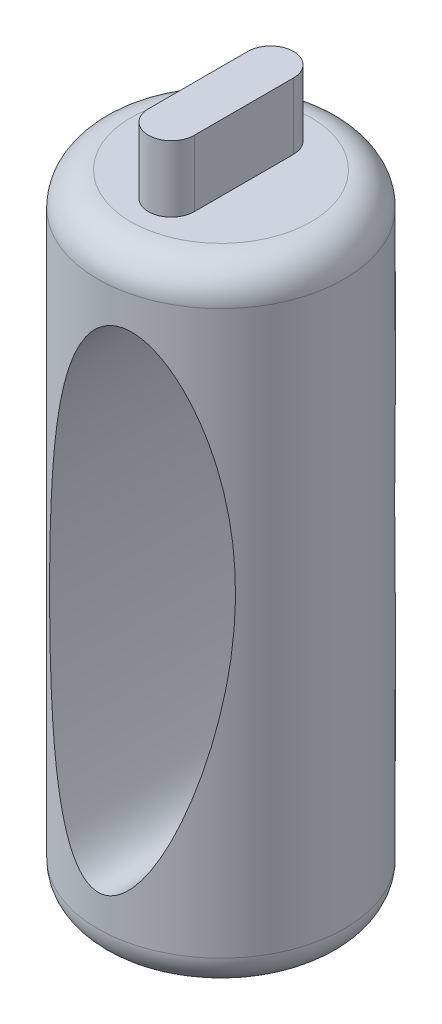
ISO-10303-21;
HEADER;
FILE_DESCRIPTION(('STEP AP214'),'2;1');
FILE_NAME('part.step','',(''),(''),'','','');
FILE_SCHEMA(('AUTOMOTIVE_DESIGN { 1 0 10303 214 1 1 1 1 }'));
ENDSEC;
DATA;
#1=APPLICATION_CONTEXT('core data for automotive mechanical design processes');
#2=APPLICATION_PROTOCOL_DEFINITION('international standard','automotive_design',2000,#1);
#3=PRODUCT_CONTEXT('',#1,'mechanical');
#4=PRODUCT('Part','Part','',(#3));
#5=PRODUCT_RELATED_PRODUCT_CATEGORY('part','',(#4));
#6=PRODUCT_DEFINITION_FORMATION('','',#4);
#7=PRODUCT_DEFINITION_CONTEXT('part definition',#1,'design');
#8=PRODUCT_DEFINITION('design','',#6,#7);
#9=PRODUCT_DEFINITION_SHAPE('','',#8);
#10=(LENGTH_UNIT() NAMED_UNIT(*) SI_UNIT(.MILLI.,.METRE.));
#11=(NAMED_UNIT(*) PLANE_ANGLE_UNIT() SI_UNIT($,.RADIAN.));
#12=(NAMED_UNIT(*) SI_UNIT($,.STERADIAN.) SOLID_ANGLE_UNIT());
#13=UNCERTAINTY_MEASURE_WITH_UNIT(LENGTH_MEASURE(1.E-05),#10,'distance_accuracy_value','');
#14=(GEOMETRIC_REPRESENTATION_CONTEXT(3) GLOBAL_UNCERTAINTY_ASSIGNED_CONTEXT((#13)) GLOBAL_UNIT_ASSIGNED_CONTEXT((#10,
#11,#12)) REPRESENTATION_CONTEXT('',''));
#15=CARTESIAN_POINT('',(0.,0.,0.));
#16=DIRECTION('',(0.,0.,1.));
#17=DIRECTION('',(1.,0.,0.));
#18=AXIS2_PLACEMENT_3D('',#15,#16,#17);
#19=CARTESIAN_POINT('',(0.,42.,-3.));
#20=DIRECTION('',(0.,-1.,0.));
#21=DIRECTION('',(0.,0.,-1.));
#22=AXIS2_PLACEMENT_3D('',#19,#20,#21);
#23=CYLINDRICAL_SURFACE('',#22,1.38570218312154);
#24=CARTESIAN_POINT('',(0.,38.,-3.));
#25=DIRECTION('',(0.,1.,0.));
#26=DIRECTION('',(0.,0.,1.));
#27=AXIS2_PLACEMENT_3D('',#24,#25,#26);
#28=CIRCLE('',#27,1.38570218312154);
#29=CARTESIAN_POINT('',(1.38570218312154,38.,-3.));
#30=VERTEX_POINT('',#29);
#31=CARTESIAN_POINT('',(-1.38570218312154,38.,-3.));
#32=VERTEX_POINT('',#31);
#33=EDGE_CURVE('E104',#30,#32,#28,.T.);
#34=ORIENTED_EDGE('',*,*,#33,.T.);
#35=DIRECTION('',(0.,-1.,0.));
#36=VECTOR('',#35,1.);
#37=CARTESIAN_POINT('',(-1.38570218312154,42.,-3.));
#38=LINE('',#37,#36);
#39=CARTESIAN_POINT('',(-1.38570218312154,42.,-3.));
#40=VERTEX_POINT('',#39);
#41=EDGE_CURVE('E12',#40,#32,#38,.T.);
#42=ORIENTED_EDGE('',*,*,#41,.F.);
#43=CARTESIAN_POINT('',(0.,42.,-3.));
#44=DIRECTION('',(0.,1.,0.));
#45=DIRECTION('',(0.,0.,1.));
#46=AXIS2_PLACEMENT_3D('',#43,#44,#45);
#47=CIRCLE('',#46,1.38570218312154);
#48=CARTESIAN_POINT('',(1.38570218312154,42.,-3.));
#49=VERTEX_POINT('',#48);
#50=EDGE_CURVE('E92',#49,#40,#47,.T.);
#51=ORIENTED_EDGE('',*,*,#50,.F.);
#52=DIRECTION('',(0.,-1.,0.));
#53=VECTOR('',#52,1.);
#54=CARTESIAN_POINT('',(1.38570218312154,42.,-3.));
#55=LINE('',#54,#53);
#56=EDGE_CURVE('E100',#49,#30,#55,.T.);
#57=ORIENTED_EDGE('',*,*,#56,.T.);
#58=EDGE_LOOP('',(#34,#42,#51,#57));
#59=FACE_BOUND('',#58,.T.);
#60=ADVANCED_FACE('F41',(#59),#23,.T.);
#61=CARTESIAN_POINT('',(-1.38570218312154,42.,-3.));
#62=DIRECTION('',(1.,0.,0.));
#63=DIRECTION('',(0.,0.,-1.));
#64=AXIS2_PLACEMENT_3D('',#61,#62,#63);
#65=PLANE('',#64);
#66=DIRECTION('',(0.,0.,1.));
#67=VECTOR('',#66,1.);
#68=CARTESIAN_POINT('',(-1.38570218312154,38.,-3.));
#69=LINE('',#68,#67);
#70=CARTESIAN_POINT('',(-1.38570218312154,38.,3.));
#71=VERTEX_POINT('',#70);
#72=EDGE_CURVE('E96',#32,#71,#69,.T.);
#73=ORIENTED_EDGE('',*,*,#72,.T.);
#74=DIRECTION('',(0.,-1.,0.));
#75=VECTOR('',#74,1.);
#76=CARTESIAN_POINT('',(-1.38570218312154,42.,3.));
#77=LINE('',#76,#75);
#78=CARTESIAN_POINT('',(-1.38570218312154,42.,3.));
#79=VERTEX_POINT('',#78);
#80=EDGE_CURVE('E49',#79,#71,#77,.T.);
#81=ORIENTED_EDGE('',*,*,#80,.F.);
#82=DIRECTION('',(0.,0.,1.));
#83=VECTOR('',#82,1.);
#84=CARTESIAN_POINT('',(-1.38570218312154,42.,-3.));
#85=LINE('',#84,#83);
#86=EDGE_CURVE('E87',#40,#79,#85,.T.);
#87=ORIENTED_EDGE('',*,*,#86,.F.);
#88=ORIENTED_EDGE('',*,*,#41,.T.);
#89=EDGE_LOOP('',(#73,#81,#87,#88));
#90=FACE_BOUND('',#89,.T.);
#91=ADVANCED_FACE('F95',(#90),#65,.F.);
#92=CARTESIAN_POINT('',(0.,42.,3.));
#93=DIRECTION('',(0.,-1.,0.));
#94=DIRECTION('',(0.,0.,-1.));
#95=AXIS2_PLACEMENT_3D('',#92,#93,#94);
#96=CYLINDRICAL_SURFACE('',#95,1.38570218312154);
#97=CARTESIAN_POINT('',(0.,38.,3.));
#98=DIRECTION('',(0.,1.,0.));
#99=DIRECTION('',(0.,0.,1.));
#100=AXIS2_PLACEMENT_3D('',#97,#98,#99);
#101=CIRCLE('',#100,1.38570218312154);
#102=CARTESIAN_POINT('',(1.38570218312154,38.,3.));
#103=VERTEX_POINT('',#102);
#104=EDGE_CURVE('E74',#71,#103,#101,.T.);
#105=ORIENTED_EDGE('',*,*,#104,.T.);
#106=DIRECTION('',(0.,-1.,0.));
#107=VECTOR('',#106,1.);
#108=CARTESIAN_POINT('',(1.38570218312154,42.,3.));
#109=LINE('',#108,#107);
#110=CARTESIAN_POINT('',(1.38570218312154,42.,3.));
#111=VERTEX_POINT('',#110);
#112=EDGE_CURVE('E97',#111,#103,#109,.T.);
#113=ORIENTED_EDGE('',*,*,#112,.F.);
#114=CARTESIAN_POINT('',(0.,42.,3.));
#115=DIRECTION('',(0.,1.,0.));
#116=DIRECTION('',(0.,0.,1.));
#117=AXIS2_PLACEMENT_3D('',#114,#115,#116);
#118=CIRCLE('',#117,1.38570218312154);
#119=EDGE_CURVE('E90',#79,#111,#118,.T.);
#120=ORIENTED_EDGE('',*,*,#119,.F.);
#121=ORIENTED_EDGE('',*,*,#80,.T.);
#122=EDGE_LOOP('',(#105,#113,#120,#121));
#123=FACE_BOUND('',#122,.T.);
#124=ADVANCED_FACE('F98',(#123),#96,.T.);
#125=CARTESIAN_POINT('',(1.38570218312154,42.,-3.));
#126=DIRECTION('',(-1.,0.,0.));
#127=DIRECTION('',(0.,0.,1.));
#128=AXIS2_PLACEMENT_3D('',#125,#126,#127);
#129=PLANE('',#128);
#130=DIRECTION('',(0.,0.,-1.));
#131=VECTOR('',#130,1.);
#132=CARTESIAN_POINT('',(1.38570218312154,38.,-3.));
#133=LINE('',#132,#131);
#134=EDGE_CURVE('E80',#103,#30,#133,.T.);
#135=ORIENTED_EDGE('',*,*,#134,.T.);
#136=ORIENTED_EDGE('',*,*,#56,.F.);
#137=DIRECTION('',(0.,0.,-1.));
#138=VECTOR('',#137,1.);
#139=CARTESIAN_POINT('',(1.38570218312154,42.,-3.));
#140=LINE('',#139,#138);
#141=EDGE_CURVE('E57',#111,#49,#140,.T.);
#142=ORIENTED_EDGE('',*,*,#141,.F.);
#143=ORIENTED_EDGE('',*,*,#112,.T.);
#144=EDGE_LOOP('',(#135,#136,#142,#143));
#145=FACE_BOUND('',#144,.T.);
#146=ADVANCED_FACE('F111',(#145),#129,.F.);
#147=CARTESIAN_POINT('',(0.,42.,-3.));
#148=DIRECTION('',(0.,1.,0.));
#149=DIRECTION('',(0.,0.,1.));
#150=AXIS2_PLACEMENT_3D('',#147,#148,#149);
#151=PLANE('',#150);
#152=ORIENTED_EDGE('',*,*,#50,.T.);
#153=ORIENTED_EDGE('',*,*,#86,.T.);
#154=ORIENTED_EDGE('',*,*,#119,.T.);
#155=ORIENTED_EDGE('',*,*,#141,.T.);
#156=EDGE_LOOP('',(#152,#153,#154,#155));
#157=FACE_BOUND('',#156,.T.);
#158=ADVANCED_FACE('F88',(#157),#151,.T.);
#159=CARTESIAN_POINT('',(0.,38.,-3.));
#160=DIRECTION('',(0.,1.,0.));
#161=DIRECTION('',(0.,0.,1.));
#162=AXIS2_PLACEMENT_3D('',#159,#160,#161);
#163=PLANE('',#162);
#164=ORIENTED_EDGE('',*,*,#33,.F.);
#165=ORIENTED_EDGE('',*,*,#134,.F.);
#166=ORIENTED_EDGE('',*,*,#104,.F.);
#167=ORIENTED_EDGE('',*,*,#72,.F.);
#168=EDGE_LOOP('',(#164,#165,#166,#167));
#169=FACE_BOUND('',#168,.T.);
#170=ADVANCED_FACE('F114',(#169),#163,.F.);
#171=CLOSED_SHELL('',(#60,#91,#124,#146,#158,#170));
#172=MANIFOLD_SOLID_BREP('B2',#171);
#173=CARTESIAN_POINT('',(0.,38.,0.));
#174=DIRECTION('',(0.,-1.,0.));
#175=DIRECTION('',(0.,0.,-1.));
#176=AXIS2_PLACEMENT_3D('',#173,#174,#175);
#177=CYLINDRICAL_SURFACE('',#176,7.45);
#178=CARTESIAN_POINT('',(0.,33.445763635603,-7.45));
#179=CARTESIAN_POINT('',(-0.095559366362131,33.3616353146619,-7.45000133325339));
#180=CARTESIAN_POINT('',(-0.18685954519611,33.2726639794885,-7.44817186689996));
#181=CARTESIAN_POINT('',(-0.362034543329289,33.0877225588869,-7.44171447493551));
#182=CARTESIAN_POINT('',(-0.445900833662442,32.9917446591259,-7.43708338144601));
#183=CARTESIAN_POINT('',(-0.607531411127159,32.7941749896589,-7.42563106159477));
#184=CARTESIAN_POINT('',(-0.685264655916412,32.6925586067938,-7.41879948509376));
#185=CARTESIAN_POINT('',(-0.835030740059926,32.4854241257201,-7.40343725277449));
#186=CARTESIAN_POINT('',(-0.907065706480859,32.3799075051884,-7.39490723517613));
#187=CARTESIAN_POINT('',(-1.05844211720148,32.1469684208612,-7.37489075051447));
#188=CARTESIAN_POINT('',(-1.13684021875951,32.0189572628576,-7.36314816898597));
#189=CARTESIAN_POINT('',(-1.28777916363685,31.7596581308598,-7.3382538338295));
#190=CARTESIAN_POINT('',(-1.36031905535099,31.6283696290116,-7.3251018520633));
#191=CARTESIAN_POINT('',(-1.50012336615484,31.3635179698189,-7.29775249243825));
#192=CARTESIAN_POINT('',(-1.56739947607325,31.2299607043427,-7.28355757536031));
#193=CARTESIAN_POINT('',(-1.69745770886317,30.9607574778237,-7.25434831105244));
#194=CARTESIAN_POINT('',(-1.76023933785904,30.8251112892236,-7.23933387408815));
#195=CARTESIAN_POINT('',(-1.94228538612534,30.416282781792,-7.19345047834024));
#196=CARTESIAN_POINT('',(-2.05559554600674,30.1405436873183,-7.16167078535632));
#197=CARTESIAN_POINT('',(-2.26919928592416,29.5841349338461,-7.09687576104809));
#198=CARTESIAN_POINT('',(-2.36948666688798,29.3034629983759,-7.06385985082641));
#199=CARTESIAN_POINT('',(-2.55902775265801,28.7382451477841,-6.99742549629972));
#200=CARTESIAN_POINT('',(-2.64827310382258,28.453696478273,-6.9640067679722));
#201=CARTESIAN_POINT('',(-2.81707891731236,27.8816910740069,-6.89744796386881));
#202=CARTESIAN_POINT('',(-2.8966382909451,27.5942340162782,-6.86430791980572));
#203=CARTESIAN_POINT('',(-3.04712984956476,27.0169281080915,-6.79884033710758));
#204=CARTESIAN_POINT('',(-3.11806037668168,26.7270788093969,-6.76651295555389));
#205=CARTESIAN_POINT('',(-3.25207453888987,26.1454217457018,-6.70313370502013));
#206=CARTESIAN_POINT('',(-3.31515770614574,25.8536138650287,-6.67208191216055));
#207=CARTESIAN_POINT('',(-3.43399641823802,25.2687570993174,-6.61170213502369));
#208=CARTESIAN_POINT('',(-3.48976192199809,24.9757104731335,-6.58237183859638));
#209=CARTESIAN_POINT('',(-3.59452341543175,24.3882097999038,-6.52575164487648));
#210=CARTESIAN_POINT('',(-3.64351913742548,24.0937556976819,-6.49846182828485));
#211=CARTESIAN_POINT('',(-3.78087850324158,23.2087087547653,-6.42017494573415));
#212=CARTESIAN_POINT('',(-3.85964442724857,22.6162810678218,-6.37274460644442));
#213=CARTESIAN_POINT('',(-3.99336064127281,21.4279873858046,-6.28981087810162));
#214=CARTESIAN_POINT('',(-4.0483125800306,20.8321216316578,-6.25430666339197));
#215=CARTESIAN_POINT('',(-4.13515321713304,19.6380143258245,-6.19723490973267));
#216=CARTESIAN_POINT('',(-4.16704138456758,19.0397727197663,-6.17566769160307));
#217=CARTESIAN_POINT('',(-4.20767177152846,17.842049320868,-6.14805656498741));
#218=CARTESIAN_POINT('',(-4.21641046160843,17.2425673528603,-6.14201502360193));
#219=CARTESIAN_POINT('',(-4.20984384846647,16.0437156036525,-6.14652591117268));
#220=CARTESIAN_POINT('',(-4.19453766114917,15.444345827388,-6.15707895028766));
#221=CARTESIAN_POINT('',(-4.15212357351087,14.5465013335333,-6.185677681845));
#222=CARTESIAN_POINT('',(-4.13473479889267,14.2473304290603,-6.19734429821697));
#223=CARTESIAN_POINT('',(-4.09310035968074,13.649666680584,-6.22492315190925));
#224=CARTESIAN_POINT('',(-4.06885502218835,13.351173804919,-6.24083518669426));
#225=CARTESIAN_POINT('',(-4.01305658764928,12.7551283745065,-6.27686047707864));
#226=CARTESIAN_POINT('',(-3.98150360271659,12.4575758054039,-6.29697366822337));
#227=CARTESIAN_POINT('',(-3.91050210369227,11.8637351625092,-6.34131126010247));
#228=CARTESIAN_POINT('',(-3.87105411105152,11.5674470065243,-6.36553538930081));
#229=CARTESIAN_POINT('',(-3.78353462709423,10.9767671250676,-6.41794110366845));
#230=CARTESIAN_POINT('',(-3.73547098351341,10.6823739242483,-6.44611908236396));
#231=CARTESIAN_POINT('',(-3.62971941896753,10.0958791881158,-6.50625407191333));
#232=CARTESIAN_POINT('',(-3.57203727378245,9.80377638700682,-6.53820881153994));
#233=CARTESIAN_POINT('',(-3.44568034079578,9.22239277587441,-6.60567339581533));
#234=CARTESIAN_POINT('',(-3.37700689498523,8.9331116259082,-6.64118280625595));
#235=CARTESIAN_POINT('',(-3.2266583648655,8.35775007371591,-6.71552357254923));
#236=CARTESIAN_POINT('',(-3.14495953801209,8.07167655766847,-6.75436093358453));
#237=CARTESIAN_POINT('',(-2.99072969182996,7.58333122681723,-6.82371231491368));
#238=CARTESIAN_POINT('',(-2.9219251353869,7.37979084043545,-6.85355294421821));
#239=CARTESIAN_POINT('',(-2.77465944469615,6.97630215876276,-6.91448700828101));
#240=CARTESIAN_POINT('',(-2.69619438266188,6.7763553626752,-6.94558094913413));
#241=CARTESIAN_POINT('',(-2.52791882591415,6.38209763931932,-7.00858119061557));
#242=CARTESIAN_POINT('',(-2.43814519809346,6.1877708137921,-7.04048459393636));
#243=CARTESIAN_POINT('',(-2.29278793589763,5.90186019652106,-7.08859649953564));
#244=CARTESIAN_POINT('',(-2.24257144063859,5.80751745865319,-7.10467113940736));
#245=CARTESIAN_POINT('',(-2.13809492362413,5.6211049153731,-7.13680919809026));
#246=CARTESIAN_POINT('',(-2.08383575459147,5.52903463605414,-7.15287261855048));
#247=CARTESIAN_POINT('',(-1.98850640942773,5.37623803660738,-7.17983030835023));
#248=CARTESIAN_POINT('',(-1.94865417184928,5.31475957965109,-7.19076165350053));
#249=CARTESIAN_POINT('',(-1.86658203985435,5.19339213906903,-7.21250091610555));
#250=CARTESIAN_POINT('',(-1.82436217714045,5.13350313417626,-7.22330883521064));
#251=CARTESIAN_POINT('',(-1.69366645931783,4.95645195377749,-7.25548730948471));
#252=CARTESIAN_POINT('',(-1.60124341946877,4.84205116113146,-7.27658684198625));
#253=CARTESIAN_POINT('',(-1.45269862425409,4.67822811037508,-7.30717013286391));
#254=CARTESIAN_POINT('',(-1.40124987866035,4.62466919986994,-7.31723442646294));
#255=CARTESIAN_POINT('',(-1.29484484425385,4.52105603009372,-7.3368118832402));
#256=CARTESIAN_POINT('',(-1.23988793222888,4.47100239685208,-7.34632494791891));
#257=CARTESIAN_POINT('',(-1.06953666900331,4.32752116061669,-7.37372453395438));
#258=CARTESIAN_POINT('',(-0.948323565801315,4.24038477216817,-7.3905443799816));
#259=CARTESIAN_POINT('',(-0.73627108464257,4.11911366796558,-7.41399422363826));
#260=CARTESIAN_POINT('',(-0.650110657183516,4.07717503478659,-7.42211590925749));
#261=CARTESIAN_POINT('',(-0.516653245065489,4.02471912754626,-7.43219792840492));
#262=CARTESIAN_POINT('',(-0.471470026525689,4.00897702899386,-7.43520829350123));
#263=CARTESIAN_POINT('',(-0.379914581264785,3.98130796571057,-7.44044780136253));
#264=CARTESIAN_POINT('',(-0.333542856939019,3.96937941676725,-7.4426772685625));
#265=CARTESIAN_POINT('',(-0.23953479315141,3.9495422213257,-7.4462979190202));
#266=CARTESIAN_POINT('',(-0.191891438791491,3.9416654403883,-7.4476824727373));
#267=CARTESIAN_POINT('',(-0.09606789405951,3.93025960920155,-7.44953469768171));
#268=CARTESIAN_POINT('',(-0.0478877100069661,3.9267305078261,-7.45000237969092));
#269=CARTESIAN_POINT('',(0.0486048916722725,3.92407838136806,-7.44999760303277));
#270=CARTESIAN_POINT('',(0.0969173337297471,3.92495623418111,-7.44952495705692));
#271=CARTESIAN_POINT('',(0.193238283899365,3.93102866490604,-7.44764959778526));
#272=CARTESIAN_POINT('',(0.241246795489329,3.9362231933327,-7.44624689515141));
#273=CARTESIAN_POINT('',(0.376187562833571,3.95676636834802,-7.4410066199076));
#274=CARTESIAN_POINT('',(0.46237600194327,3.97696357373366,-7.43611448634224));
#275=CARTESIAN_POINT('',(0.630782384013732,4.0291588410494,-7.42373089553339));
#276=CARTESIAN_POINT('',(0.712998693994506,4.06116171048895,-7.41623837943425));
#277=CARTESIAN_POINT('',(0.927251811465949,4.15974426625186,-7.39330499968001));
#278=CARTESIAN_POINT('',(1.05508728617027,4.23502902799787,-7.37592606165535));
#279=CARTESIAN_POINT('',(1.23684235470891,4.36125454060091,-7.34687123090128));
#280=CARTESIAN_POINT('',(1.29587566548821,4.40565462570654,-7.33666367740263));
#281=CARTESIAN_POINT('',(1.41084264014815,4.49813127065099,-7.31542409256991));
#282=CARTESIAN_POINT('',(1.46677692993871,4.54620708339964,-7.30439222878687));
#283=CARTESIAN_POINT('',(1.62702511791446,4.69197238876129,-7.27096935757744));
#284=CARTESIAN_POINT('',(1.72737067923682,4.79380341943515,-7.24765208401551));
#285=CARTESIAN_POINT('',(1.9189785795817,5.00533343037843,-7.19929005119359));
#286=CARTESIAN_POINT('',(2.01023153679397,5.11504034034024,-7.17424355189232));
#287=CARTESIAN_POINT('',(2.18517141902561,5.34031503706627,-7.12290980264165));
#288=CARTESIAN_POINT('',(2.26884534204161,5.45589238384632,-7.09662053399902));
#289=CARTESIAN_POINT('',(2.4295833845175,5.69126540493396,-7.0432085847643));
#290=CARTESIAN_POINT('',(2.50664998985838,5.81105946863965,-7.01608622287103));
#291=CARTESIAN_POINT('',(2.66812368476013,6.0751912136693,-6.95645507741825));
#292=CARTESIAN_POINT('',(2.75145728512371,6.22015718568031,-6.92383385520196));
#293=CARTESIAN_POINT('',(2.91149950737513,6.51358951295815,-6.85807168661675));
#294=CARTESIAN_POINT('',(2.98820708271726,6.66205641648175,-6.82493065912049));
#295=CARTESIAN_POINT('',(3.13575944023503,6.96150763627878,-6.75840597233381));
#296=CARTESIAN_POINT('',(3.20661329657954,7.11248760310619,-6.72502277928621));
#297=CARTESIAN_POINT('',(3.34328679478344,7.41668859243681,-6.65813113874973));
#298=CARTESIAN_POINT('',(3.40910591967009,7.5699098431589,-6.6246226787678));
#299=CARTESIAN_POINT('',(3.59954944911827,8.03158130185945,-6.52429123346263));
#300=CARTESIAN_POINT('',(3.71752194645588,8.34279024784317,-6.45749477729994));
#301=CARTESIAN_POINT('',(3.93891445054249,8.97054670450751,-6.32487517795325));
#302=CARTESIAN_POINT('',(4.04233129513221,9.2870953585438,-6.25905224903526));
#303=CARTESIAN_POINT('',(4.23667013940377,9.92405442958563,-6.12917342164473));
#304=CARTESIAN_POINT('',(4.32760220181417,10.2444615074133,-6.06511613374993));
#305=CARTESIAN_POINT('',(4.49860244973403,10.8886012868056,-5.93938766480218));
#306=CARTESIAN_POINT('',(4.57867084071441,11.2123339253474,-5.87771643863603));
#307=CARTESIAN_POINT('',(4.7291519940134,11.8630269631762,-5.7573355199744));
#308=CARTESIAN_POINT('',(4.79955221544631,12.1899909758699,-5.69862973525987));
#309=CARTESIAN_POINT('',(4.93139477070238,12.8463767886903,-5.58492780445907));
#310=CARTESIAN_POINT('',(4.99283654378531,13.1757987413125,-5.52993189070212));
#311=CARTESIAN_POINT('',(5.10736995689611,13.8368797129184,-5.42432886231999));
#312=CARTESIAN_POINT('',(5.1604595332657,14.1685392637229,-5.37372283372761));
#313=CARTESIAN_POINT('',(5.25869347631886,14.8337676064874,-5.27762687243103));
#314=CARTESIAN_POINT('',(5.30383750764063,15.1673364784219,-5.23213715570292));
#315=CARTESIAN_POINT('',(5.42783014762817,16.1706329739823,-5.10444670682545));
#316=CARTESIAN_POINT('',(5.49524667520995,16.8429936031316,-5.03101760478229));
#317=CARTESIAN_POINT('',(5.5742959386626,17.8550220479437,-4.94279425918096));
#318=CARTESIAN_POINT('',(5.59696649653179,18.1929478077731,-4.917039788079));
#319=CARTESIAN_POINT('',(5.63493990223665,18.8697228950255,-4.87348004730683));
#320=CARTESIAN_POINT('',(5.65024320157421,19.2085721645709,-4.85567429050511));
#321=CARTESIAN_POINT('',(5.67342938985681,19.8871757951843,-4.82856233591636));
#322=CARTESIAN_POINT('',(5.68130547715004,20.2269307006859,-4.81926392917559));
#323=CARTESIAN_POINT('',(5.68946843977815,20.9066668858781,-4.8096249231351));
#324=CARTESIAN_POINT('',(5.68975525773613,21.2466481672608,-4.8092843915593));
#325=CARTESIAN_POINT('',(5.68251948644201,21.9264127974488,-4.81783185074956));
#326=CARTESIAN_POINT('',(5.67499692962144,22.2661961470702,-4.82671980319069));
#327=CARTESIAN_POINT('',(5.65183677302511,22.9451102414678,-4.85381934875673));
#328=CARTESIAN_POINT('',(5.63619940980501,23.2842410049783,-4.8720306700948));
#329=CARTESIAN_POINT('',(5.59966268560265,23.9058334656485,-4.9139506654423));
#330=CARTESIAN_POINT('',(5.58004722981243,24.1884657639882,-4.93626756998807));
#331=CARTESIAN_POINT('',(5.53454527929009,24.7526512495976,-4.98723147805554));
#332=CARTESIAN_POINT('',(5.50865889584227,25.034204455927,-5.01587836924409));
#333=CARTESIAN_POINT('',(5.45022349115206,25.595905172383,-5.07931339851637));
#334=CARTESIAN_POINT('',(5.41767497547689,25.8760527875237,-5.11410107056897));
#335=CARTESIAN_POINT('',(5.34541194468093,26.434606965481,-5.18958564581247));
#336=CARTESIAN_POINT('',(5.30569783056392,26.713013624824,-5.23028221830249));
#337=CARTESIAN_POINT('',(5.21095019580463,27.31546115944,-5.3248223343611));
#338=CARTESIAN_POINT('',(5.15445647816723,27.639109840953,-5.37972310594492));
#339=CARTESIAN_POINT('',(5.02938214437949,28.2825406361381,-5.49683107774514));
#340=CARTESIAN_POINT('',(4.96080845412228,28.6023248537826,-5.55903408454029));
#341=CARTESIAN_POINT('',(4.80959225278684,29.2372356321326,-5.6903779020129));
#342=CARTESIAN_POINT('',(4.7269472870683,29.5523613697557,-5.7595199222896));
#343=CARTESIAN_POINT('',(4.59021468166491,30.0204916623127,-5.86820229308929));
#344=CARTESIAN_POINT('',(4.54245634624691,30.1759259983601,-5.90529691058202));
#345=CARTESIAN_POINT('',(4.44219574002623,30.4848579159785,-5.98108297941203));
#346=CARTESIAN_POINT('',(4.38969384555542,30.6383556500914,-6.01977430394193));
#347=CARTESIAN_POINT('',(4.27063458655768,30.9670822363678,-6.10494542368156));
#348=CARTESIAN_POINT('',(4.20316685840553,31.141915402424,-6.15169035687138));
#349=CARTESIAN_POINT('',(4.05983794217564,31.4876482200146,-6.24721087155697));
#350=CARTESIAN_POINT('',(3.98397382835564,31.6585464752019,-6.29598715716673));
#351=CARTESIAN_POINT('',(3.82251029093161,31.9944843216009,-6.39530141890085));
#352=CARTESIAN_POINT('',(3.73694243650302,32.1595407421419,-6.44583333128538));
#353=CARTESIAN_POINT('',(3.55375610893099,32.4821976549018,-6.54861604785363));
#354=CARTESIAN_POINT('',(3.45614854600651,32.6398047210341,-6.60086526479312));
#355=CARTESIAN_POINT('',(3.26808299070705,32.9119804470372,-6.69557562388548));
#356=CARTESIAN_POINT('',(3.18047934842996,33.0286014184699,-6.73776961841795));
#357=CARTESIAN_POINT('',(2.99370012699236,33.2525756839413,-6.82281694407366));
#358=CARTESIAN_POINT('',(2.89450449273994,33.3599123401242,-6.86567130310759));
#359=CARTESIAN_POINT('',(2.73483791487639,33.5109083490638,-6.93011504137032));
#360=CARTESIAN_POINT('',(2.67939404802874,33.5598661589005,-6.951769166965));
#361=CARTESIAN_POINT('',(2.5647145377712,33.653284423515,-6.9948908325645));
#362=CARTESIAN_POINT('',(2.50547813590811,33.6977439740887,-7.0163583342661));
#363=CARTESIAN_POINT('',(2.38323524420314,33.7809599373367,-7.05881418913557));
#364=CARTESIAN_POINT('',(2.32024180127365,33.8197346348865,-7.07980388650974));
#365=CARTESIAN_POINT('',(2.19035626541974,33.8904691167686,-7.1210589422414));
#366=CARTESIAN_POINT('',(2.12346734466939,33.92243435006,-7.14132486887098));
#367=CARTESIAN_POINT('',(1.96909506462731,33.9850514255083,-7.18561590038557));
#368=CARTESIAN_POINT('',(1.88058544362364,34.0134566936832,-7.20934333042131));
#369=CARTESIAN_POINT('',(1.69945443469325,34.0550168267198,-7.25417334172146));
#370=CARTESIAN_POINT('',(1.60683813944503,34.0681900603517,-7.27527905710412));
#371=CARTESIAN_POINT('',(1.41970317041967,34.0779220357085,-7.31410227729447));
#372=CARTESIAN_POINT('',(1.32517947780143,34.0744290011309,-7.33180904530603));
#373=CARTESIAN_POINT('',(1.13746015190261,34.0511464882788,-7.36327197230093));
#374=CARTESIAN_POINT('',(1.04426606268652,34.0313394191502,-7.37702384525427));
#375=CARTESIAN_POINT('',(0.840246528642301,33.9711548448153,-7.40333743669472));
#376=CARTESIAN_POINT('',(0.730406445585736,33.927044868947,-7.41486526689003));
#377=CARTESIAN_POINT('',(0.518599180895217,33.8222143951793,-7.43269295425141));
#378=CARTESIAN_POINT('',(0.416643138766801,33.7614709262369,-7.43898553258484));
#379=CARTESIAN_POINT('',(0.263050502726626,33.6566914624518,-7.44556340907986));
#380=CARTESIAN_POINT('',(0.208623334657887,33.6166980762266,-7.44726826198816));
#381=CARTESIAN_POINT('',(0.102402227375315,33.5335066201161,-7.44948518005723));
#382=CARTESIAN_POINT('',(0.0506039154914766,33.4903141867985,-7.44999929396935));
#383=CARTESIAN_POINT('',(0.,33.445763635603,-7.45));
#384=B_SPLINE_CURVE_WITH_KNOTS('',3,(#178,#179,#180,#181,#182,#183,#184,#185,#186,#187,#188,
#189,#190,#191,#192,#193,#194,#195,#196,#197,#198,#199,#200,#201,#202,#203,#204,#205,#206,#207,
#208,#209,#210,#211,#212,#213,#214,#215,#216,#217,#218,#219,#220,#221,#222,#223,#224,#225,#226,
#227,#228,#229,#230,#231,#232,#233,#234,#235,#236,#237,#238,#239,#240,#241,#242,#243,#244,#245,
#246,#247,#248,#249,#250,#251,#252,#253,#254,#255,#256,#257,#258,#259,#260,#261,#262,#263,#264,
#265,#266,#267,#268,#269,#270,#271,#272,#273,#274,#275,#276,#277,#278,#279,#280,#281,#282,#283,
#284,#285,#286,#287,#288,#289,#290,#291,#292,#293,#294,#295,#296,#297,#298,#299,#300,#301,#302,
#303,#304,#305,#306,#307,#308,#309,#310,#311,#312,#313,#314,#315,#316,#317,#318,#319,#320,#321,
#322,#323,#324,#325,#326,#327,#328,#329,#330,#331,#332,#333,#334,#335,#336,#337,#338,#339,#340,
#341,#342,#343,#344,#345,#346,#347,#348,#349,#350,#351,#352,#353,#354,#355,#356,#357,#358,#359,
#360,#361,#362,#363,#364,#365,#366,#367,#368,#369,#370,#371,#372,#373,#374,#375,#376,#377,#378,
#379,#380,#381,#382,#383),.UNSPECIFIED.,.T.,.F.,(4,2,2,2,2,2,2,2,2,2,2,2,2,2,2,2,2,2,2,2,2,2,2,
2,2,2,2,2,2,2,2,2,2,2,2,2,2,2,2,2,2,2,2,2,2,2,2,2,2,2,2,2,2,2,2,2,2,2,2,2,2,2,2,2,2,2,2,2,2,2,2,
2,2,2,2,2,2,2,2,2,2,2,2,2,2,2,2,2,2,2,2,2,2,2,2,2,2,2,2,2,2,2,4),(0.,0.38186298279628,
0.764158557946579,1.14827921084514,1.53225579495159,1.98376815391927,2.43535370945606,
2.88590601078596,3.33650774526392,4.235453291303,5.13482519475214,6.03487339404847,
6.93502266448697,7.8353446093875,8.73572020300959,9.63485743919412,10.534030217453,
12.331914200874,14.1296736894673,15.9274745597702,17.7255495130071,19.5236905804079,
20.4233102865106,21.322887082312,22.2224500777118,23.1219536782093,24.0206420733775,
24.9187927489521,25.8168338476885,26.7165310071644,27.3670799590063,28.0178942912024,
28.666639311482,28.9907933460749,29.3148791992516,29.537054154993,29.7592261365146,
30.2040862994071,30.4287713895836,30.653496505879,31.1013986523566,31.3888122851908,
31.5324864112981,31.6761007749771,31.820827974364,31.9655534718299,32.1103078007559,
32.2550604702796,32.5198777788701,32.7848030457787,33.2301440111599,33.4537662109325,
33.6773430797946,34.1111673495849,34.5454347050968,34.9804334785223,35.4152678668714,
35.9261519449042,36.4371165674002,36.9472736431964,37.4574830324576,38.4753548738576,
39.4934475037868,40.5107146729506,41.5279625992661,42.5465178121191,43.565136752516,
44.584006979041,45.6029201992478,47.6406138602809,48.6594708575993,49.6782654063898,
50.6979920378416,51.7177263786952,52.7374564847144,53.7571568661307,54.6095915460183,
55.4620110996522,56.3143659899467,57.1666731952373,58.1656604284311,59.1640767585822,
60.162667434593,60.6629478289306,61.1631885681469,61.7424165944426,62.3218470934957,
62.8994438667651,63.4765210229025,63.9315416551773,64.3873615016068,64.6183931354981,
64.8494711176391,65.0797887342215,65.3099213516669,65.5965188261173,65.8827703223769,
66.1699116805248,66.457363059132,66.8121682696774,67.1674659631577,67.3700321052998,
67.5722494582016),.UNSPECIFIED.);
#385=CARTESIAN_POINT('',(0.,33.445763635603,-7.45));
#386=VERTEX_POINT('',#385);
#387=EDGE_CURVE('E40',#386,#386,#384,.T.);
#388=ORIENTED_EDGE('',*,*,#387,.T.);
#389=EDGE_LOOP('',(#388));
#390=FACE_BOUND('',#389,.T.);
#391=CARTESIAN_POINT('',(-0.0375692407950448,3.92690054668549,7.44990527135386));
#392=CARTESIAN_POINT('',(-0.0862797263327172,3.92940245546408,7.44966022330682));
#393=CARTESIAN_POINT('',(-0.13485871560961,3.93415849116264,7.44893550544009));
#394=CARTESIAN_POINT('',(-0.231366199876068,3.94806254681654,7.44656312040158));
#395=CARTESIAN_POINT('',(-0.279294551485174,3.95721151918795,7.44491525307231));
#396=CARTESIAN_POINT('',(-0.421605013136743,3.99096725261345,7.43866517685651));
#397=CARTESIAN_POINT('',(-0.514479586924385,4.02188093325473,7.43275672197585));
#398=CARTESIAN_POINT('',(-0.717804460333165,4.10771660670122,7.41621873680391));
#399=CARTESIAN_POINT('',(-0.82636968942116,4.1668348102498,7.40475201648327));
#400=CARTESIAN_POINT('',(-1.03263298649681,4.30117618881548,7.37882364355019));
#401=CARTESIAN_POINT('',(-1.13030499092994,4.37643678132774,7.36435503525724));
#402=CARTESIAN_POINT('',(-1.30280767294745,4.52711284466371,7.33564935413532));
#403=CARTESIAN_POINT('',(-1.3789387158184,4.60111793207823,7.32164791902599));
#404=CARTESIAN_POINT('',(-1.52448525506633,4.75535364518341,7.29273298641614));
#405=CARTESIAN_POINT('',(-1.59389526791706,4.83558925963424,7.27781876011381));
#406=CARTESIAN_POINT('',(-1.7269204130793,5.00085294144106,7.24740699450166));
#407=CARTESIAN_POINT('',(-1.79052348135085,5.08589041741812,7.23190833128774));
#408=CARTESIAN_POINT('',(-1.91252644130361,5.25950303051443,7.20060431458738));
#409=CARTESIAN_POINT('',(-1.97092768991829,5.3480772362684,7.18479904239999));
#410=CARTESIAN_POINT('',(-2.10590023157821,5.56437936940079,7.14663628844341));
#411=CARTESIAN_POINT('',(-2.18027515134815,5.69346302764106,7.12421247024805));
#412=CARTESIAN_POINT('',(-2.32156378530201,5.95566521989485,7.07942953387319));
#413=CARTESIAN_POINT('',(-2.38847522688857,6.08878496727271,7.0570704374089));
#414=CARTESIAN_POINT('',(-2.51585795696026,6.35792957044146,7.01266715903136));
#415=CARTESIAN_POINT('',(-2.57633595290893,6.49395121946068,6.99062267029764));
#416=CARTESIAN_POINT('',(-2.69180045938725,6.76838919378138,6.94697894354493));
#417=CARTESIAN_POINT('',(-2.74678604586293,6.90680591745459,6.92537978093197));
#418=CARTESIAN_POINT('',(-2.85168160522386,7.18487306960908,6.88284820227981));
#419=CARTESIAN_POINT('',(-2.90161454788214,7.32451445822362,6.86191309627285));
#420=CARTESIAN_POINT('',(-2.99723344951578,7.60534276239108,6.82068871419361));
#421=CARTESIAN_POINT('',(-3.04291905422235,7.74652980577059,6.80039949208689));
#422=CARTESIAN_POINT('',(-3.17424748335938,8.17192657422562,6.74061971730258));
#423=CARTESIAN_POINT('',(-3.2541927703142,8.45805553980061,6.70220423072763));
#424=CARTESIAN_POINT('',(-3.40138337876385,9.03358596341135,6.62871119981088));
#425=CARTESIAN_POINT('',(-3.46864262327926,9.32298345997122,6.59363001728089));
#426=CARTESIAN_POINT('',(-3.5923697444961,9.90451648980627,6.52704467349356));
#427=CARTESIAN_POINT('',(-3.64883600392155,10.1966524265539,6.49554104860234));
#428=CARTESIAN_POINT('',(-3.75233399714389,10.7833312654392,6.43630656121948));
#429=CARTESIAN_POINT('',(-3.79935403600852,11.0778766870602,6.40858038891358));
#430=CARTESIAN_POINT('',(-3.88485112795804,11.6685673865583,6.35711547941456));
#431=CARTESIAN_POINT('',(-3.92332749966048,11.9647127901107,6.33337706029314));
#432=CARTESIAN_POINT('',(-3.99248341459688,12.5582804953906,6.2900114535188));
#433=CARTESIAN_POINT('',(-4.0231611009112,12.8557030841135,6.27038524520622));
#434=CARTESIAN_POINT('',(-4.07727425665633,13.4514583284309,6.23533132831028));
#435=CARTESIAN_POINT('',(-4.10070933163391,13.7497910326997,6.21990384840706));
#436=CARTESIAN_POINT('',(-4.16079797185546,14.6451726285245,6.1800231163171));
#437=CARTESIAN_POINT('',(-4.18730455488849,15.2432208685789,6.16192642290821));
#438=CARTESIAN_POINT('',(-4.21564283588215,16.4400277123265,6.14256361784967));
#439=CARTESIAN_POINT('',(-4.21747754391438,17.0387862204493,6.14129545304962));
#440=CARTESIAN_POINT('',(-4.19776273843298,18.2356058732248,6.15479054952202));
#441=CARTESIAN_POINT('',(-4.17621885227199,18.8336671510232,6.16954995287368));
#442=CARTESIAN_POINT('',(-4.12669319530777,19.7293363726325,6.20268180001902));
#443=CARTESIAN_POINT('',(-4.10731583435255,20.0276610244426,6.21555820368178));
#444=CARTESIAN_POINT('',(-4.06278868538365,20.6237383382451,6.24475447846508));
#445=CARTESIAN_POINT('',(-4.03763838403232,20.921490946995,6.26107465580021));
#446=CARTESIAN_POINT('',(-3.95344744427378,21.8135707356708,6.31484338355233));
#447=CARTESIAN_POINT('',(-3.88566187617954,22.406809041458,6.35710356301627));
#448=CARTESIAN_POINT('',(-3.7255439087209,23.5891061153598,6.45225030425746));
#449=CARTESIAN_POINT('',(-3.63321241103051,24.1781650361847,6.50513647568043));
#450=CARTESIAN_POINT('',(-3.47439285371823,25.0576565625475,6.59049804815258));
#451=CARTESIAN_POINT('',(-3.41804323828897,25.3502367806923,6.61996838367066));
#452=CARTESIAN_POINT('',(-3.29808124980371,25.9337301576683,6.68054558606709));
#453=CARTESIAN_POINT('',(-3.23446919636976,26.2246433892728,6.71165238089191));
#454=CARTESIAN_POINT('',(-3.09937507906252,26.8044919087731,6.77509729034231));
#455=CARTESIAN_POINT('',(-3.02789339322382,27.0934272909716,6.80743534577289));
#456=CARTESIAN_POINT('',(-2.87625242428519,27.6689142369172,6.87288125015842));
#457=CARTESIAN_POINT('',(-2.79609368918115,27.9554659499747,6.90598905039685));
#458=CARTESIAN_POINT('',(-2.62606733459942,28.5254966504148,6.97241755207484));
#459=CARTESIAN_POINT('',(-2.53620499652074,28.8089772178056,7.0057381285069));
#460=CARTESIAN_POINT('',(-2.34534661637032,29.3720242789932,7.07191983889465));
#461=CARTESIAN_POINT('',(-2.24435806767145,29.6515932659085,7.10478126547784));
#462=CARTESIAN_POINT('',(-2.02915302411652,30.2059174215588,7.16921967960171));
#463=CARTESIAN_POINT('',(-1.91493268823995,30.4806711657078,7.20079629056413));
#464=CARTESIAN_POINT('',(-1.73136671818719,30.8878910861359,7.2462972808516));
#465=CARTESIAN_POINT('',(-1.6680526323279,31.0229771554549,7.2611709154817));
#466=CARTESIAN_POINT('',(-1.53686393244709,31.2910022610205,7.29006648254098));
#467=CARTESIAN_POINT('',(-1.46898978615263,31.4239415157371,7.30408850204057));
#468=CARTESIAN_POINT('',(-1.319393425279,31.7033859148722,7.33268021935957));
#469=CARTESIAN_POINT('',(-1.23699506247113,31.8495464394995,7.34710484137487));
#470=CARTESIAN_POINT('',(-1.06452825608147,32.1375808856815,7.37407005817977));
#471=CARTESIAN_POINT('',(-0.974456294128528,32.2794528000644,7.38660978137346));
#472=CARTESIAN_POINT('',(-0.785607828101367,32.5567341673658,7.40907115457566));
#473=CARTESIAN_POINT('',(-0.686866952167314,32.6921668425437,7.41900290746835));
#474=CARTESIAN_POINT('',(-0.478634575141675,32.954629830051,7.4353434643436));
#475=CARTESIAN_POINT('',(-0.369156220888161,33.081670106555,7.44175651464775));
#476=CARTESIAN_POINT('',(-0.164118535642226,33.2952879780059,7.44872254800902));
#477=CARTESIAN_POINT('',(-0.0712598895514511,33.3843963129355,7.45029279550112));
#478=CARTESIAN_POINT('',(0.123411130892366,33.5526189743235,7.44961593955351));
#479=CARTESIAN_POINT('',(0.225233710091417,33.6317216538083,7.4473644305901));
#480=CARTESIAN_POINT('',(0.440111893793146,33.7765338723091,7.43777298389009));
#481=CARTESIAN_POINT('',(0.553297221393328,33.8420543064884,7.4303667481399));
#482=CARTESIAN_POINT('',(0.729859464065747,33.9244669635277,7.41439732379367));
#483=CARTESIAN_POINT('',(0.789784657423959,33.9492772678527,7.40827221594732));
#484=CARTESIAN_POINT('',(0.911592156046123,33.9928095494652,7.39427205645037));
#485=CARTESIAN_POINT('',(0.973473430718283,34.0115346760361,7.38639791354777));
#486=CARTESIAN_POINT('',(1.12559419669385,34.0486607595318,7.36503013970327));
#487=CARTESIAN_POINT('',(1.21661620774793,34.0634801263225,7.35057465939702));
#488=CARTESIAN_POINT('',(1.39917619383989,34.0774759458129,7.31801866496435));
#489=CARTESIAN_POINT('',(1.49071387907715,34.07666044909,7.29992003149126));
#490=CARTESIAN_POINT('',(1.6714702560016,34.0594917297349,7.26066345602134));
#491=CARTESIAN_POINT('',(1.76069227340066,34.0431622202519,7.23951022481154));
#492=CARTESIAN_POINT('',(1.93482324836055,33.9966236129381,7.19493348038122));
#493=CARTESIAN_POINT('',(2.01972828609885,33.9664021426066,7.17150795811007));
#494=CARTESIAN_POINT('',(2.22146915050134,33.8780617318859,7.11218101018709));
#495=CARTESIAN_POINT('',(2.33522096525242,33.8135057548069,7.0754595582528));
#496=CARTESIAN_POINT('',(2.55059270461836,33.6671709197963,7.00071979917627));
#497=CARTESIAN_POINT('',(2.65217622893506,33.5853423145245,6.96269801787152));
#498=CARTESIAN_POINT('',(2.83419915963839,33.4190596676198,6.89045352132964));
#499=CARTESIAN_POINT('',(2.91573879071812,33.335777002127,6.85624973262349));
#500=CARTESIAN_POINT('',(3.07116278002627,33.1622056466858,6.78805345925889));
#501=CARTESIAN_POINT('',(3.1450403762613,33.0719108891729,6.75406118572051));
#502=CARTESIAN_POINT('',(3.28626103263683,32.8859789903854,6.68648799165715));
#503=CARTESIAN_POINT('',(3.35359226298478,32.7903326521722,6.65290790824214));
#504=CARTESIAN_POINT('',(3.48246891442285,32.5950879135479,6.5863619953995));
#505=CARTESIAN_POINT('',(3.54401607750176,32.4954907159521,6.5533959834455));
#506=CARTESIAN_POINT('',(3.67040636721078,32.2789519213512,6.48355915328996));
#507=CARTESIAN_POINT('',(3.73449686639252,32.161540083137,6.4467907557591));
#508=CARTESIAN_POINT('',(3.85707446866071,31.9235424916613,6.3742093871176));
#509=CARTESIAN_POINT('',(3.91556090614565,31.8029563635483,6.33839652986126));
#510=CARTESIAN_POINT('',(4.02755796947236,31.5594301812051,6.26782663723557));
#511=CARTESIAN_POINT('',(4.08107572110139,31.4364938127371,6.23306813952188));
#512=CARTESIAN_POINT('',(4.18380419720217,31.1885454484754,6.16458324839919));
#513=CARTESIAN_POINT('',(4.23301443774516,31.0635332213407,6.13085697123145));
#514=CARTESIAN_POINT('',(4.36597279088762,30.7096562590647,6.0375303206374));
#515=CARTESIAN_POINT('',(4.44534899486273,30.4788242001211,5.9791384138921));
#516=CARTESIAN_POINT('',(4.59362806852205,30.0129339300437,5.8659826760235));
#517=CARTESIAN_POINT('',(4.66252845807806,29.7778747328273,5.81121970576956));
#518=CARTESIAN_POINT('',(4.79139673474522,29.3042472859532,5.70543338653591));
#519=CARTESIAN_POINT('',(4.85135594358392,29.0656758708923,5.65441369484663));
#520=CARTESIAN_POINT('',(4.96338207741422,28.5858799958441,5.55633639545952));
#521=CARTESIAN_POINT('',(5.0154485818697,28.3446553952247,5.50927899893855));
#522=CARTESIAN_POINT('',(5.11238022042684,27.8607998633844,5.4194484563242));
#523=CARTESIAN_POINT('',(5.15726769529964,27.6181758295067,5.37666218135935));
#524=CARTESIAN_POINT('',(5.24068366178078,27.1311298724461,5.29538577464564));
#525=CARTESIAN_POINT('',(5.27921204548957,26.8867079188301,5.25689571579753));
#526=CARTESIAN_POINT('',(5.38600916687864,26.151465646849,5.14818634552684));
#527=CARTESIAN_POINT('',(5.44555230983927,25.6583490873013,5.08466813376323));
#528=CARTESIAN_POINT('',(5.54425061939603,24.6681951779239,4.97685419656507));
#529=CARTESIAN_POINT('',(5.58341154962474,24.171158976883,4.93255303756989));
#530=CARTESIAN_POINT('',(5.64324002086377,23.1745464934923,4.8639919919865));
#531=CARTESIAN_POINT('',(5.66390555920024,22.6749699419627,4.83973427571632));
#532=CARTESIAN_POINT('',(5.68797182990459,21.6749928628065,4.8114252270506));
#533=CARTESIAN_POINT('',(5.69137755425368,21.1745926153036,4.80736805214597));
#534=CARTESIAN_POINT('',(5.6817265529393,20.1742019580698,4.81876839854513));
#535=CARTESIAN_POINT('',(5.66867012663231,19.6742115410518,4.8342255649898));
#536=CARTESIAN_POINT('',(5.62652865302345,18.6759684592951,4.88320642790143));
#537=CARTESIAN_POINT('',(5.597448450776,18.1777153150681,4.916724663237));
#538=CARTESIAN_POINT('',(5.5233407317877,17.1837705491954,4.99982957487066));
#539=CARTESIAN_POINT('',(5.4783134747908,16.688078885962,5.04941598945082));
#540=CARTESIAN_POINT('',(5.37201926248259,15.7001786507326,5.16235562442504));
#541=CARTESIAN_POINT('',(5.31075703135452,15.2079691081897,5.22570483904417));
#542=CARTESIAN_POINT('',(5.17120605817952,14.2275147633174,5.36383952280796));
#543=CARTESIAN_POINT('',(5.0929148687592,13.7392705413508,5.43862663532906));
#544=CARTESIAN_POINT('',(4.91791108387339,12.7674433398647,5.59737643434041));
#545=CARTESIAN_POINT('',(4.82119324297449,12.2838617289118,5.68134173063549));
#546=CARTESIAN_POINT('',(4.60718969004243,11.3227424015527,5.85623146392622));
#547=CARTESIAN_POINT('',(4.48991354597851,10.8452019839028,5.94715265255843));
#548=CARTESIAN_POINT('',(4.26172542835186,10.0093135836005,6.11187841822048));
#549=CARTESIAN_POINT('',(4.15583001055437,9.64940443433029,6.18466557706148));
#550=CARTESIAN_POINT('',(3.98451165134906,9.1135719458019,6.29529779633551));
#551=CARTESIAN_POINT('',(3.92528302669271,8.93551658878759,6.33244215856615));
#552=CARTESIAN_POINT('',(3.80226269151745,8.58106368405028,6.40706478533397));
#553=CARTESIAN_POINT('',(3.73847117573074,8.40466606594242,6.44454303556201));
#554=CARTESIAN_POINT('',(3.59175312254007,8.01658892066511,6.52766098098187));
#555=CARTESIAN_POINT('',(3.50763848826584,7.80536503770781,6.57334503338684));
#556=CARTESIAN_POINT('',(3.33080717678185,7.38646416360825,6.66469337456977));
#557=CARTESIAN_POINT('',(3.23808856789023,7.17878798141418,6.7103576565859));
#558=CARTESIAN_POINT('',(3.04273645033756,6.76859962256329,6.80116472618716));
#559=CARTESIAN_POINT('',(2.9401259756734,6.56607677357723,6.84630846376183));
#560=CARTESIAN_POINT('',(2.7227480321559,6.16751815126439,6.93563109260803));
#561=CARTESIAN_POINT('',(2.60798753944122,5.97147873931823,6.97981052016547));
#562=CARTESIAN_POINT('',(2.38687997104632,5.62564973515363,7.05806426486624));
#563=CARTESIAN_POINT('',(2.28319809619394,5.47424792136125,7.09244046099187));
#564=CARTESIAN_POINT('',(2.11843523596215,5.25348379813755,7.14268997682062));
#565=CARTESIAN_POINT('',(2.06190566316009,5.18087431891891,7.15923850656364));
#566=CARTESIAN_POINT('',(1.94542274416271,5.03831049526965,7.19176560588435));
#567=CARTESIAN_POINT('',(1.88546950803758,4.96835606559987,7.20774419375878));
#568=CARTESIAN_POINT('',(1.76108388597496,4.83100607191317,7.23914643339839));
#569=CARTESIAN_POINT('',(1.69661089863365,4.76364531428857,7.25456244676785));
#570=CARTESIAN_POINT('',(1.56327168766446,4.63312432035829,7.28445971860564));
#571=CARTESIAN_POINT('',(1.49440413729119,4.56996536446969,7.29894069209962));
#572=CARTESIAN_POINT('',(1.35200775079712,4.4492261549436,7.32665124198588));
#573=CARTESIAN_POINT('',(1.27849311675456,4.39163014596891,7.33988434989309));
#574=CARTESIAN_POINT('',(1.12628592300653,4.28345299584758,7.36477605983285));
#575=CARTESIAN_POINT('',(1.04759819527286,4.2328654418954,7.37643610097754));
#576=CARTESIAN_POINT('',(0.877198772903579,4.13647188451855,7.39871903959751));
#577=CARTESIAN_POINT('',(0.784954688670438,4.09153202972206,7.4091482645533));
#578=CARTESIAN_POINT('',(0.642251714894986,4.03482895740978,7.42241830825661));
#579=CARTESIAN_POINT('',(0.594001214473583,4.01772171653897,7.42644377055496));
#580=CARTESIAN_POINT('',(0.496169375563154,3.98747564831683,7.43362110430775));
#581=CARTESIAN_POINT('',(0.446587315451174,3.97433902205608,7.43677249114336));
#582=CARTESIAN_POINT('',(0.325411871920253,3.9478957283434,7.44322924372341));
#583=CARTESIAN_POINT('',(0.253287712833512,3.93681703775173,7.44604748474662));
#584=CARTESIAN_POINT('',(0.10815468595557,3.92445407643697,7.44956795735098));
#585=CARTESIAN_POINT('',(0.035146204296073,3.92316567505765,7.45027108125317));
#586=CARTESIAN_POINT('',(-0.0375692407950448,3.92690054668549,7.44990527135386));
#587=B_SPLINE_CURVE_WITH_KNOTS('',3,(#391,#392,#393,#394,#395,#396,#397,#398,#399,#400,#401,
#402,#403,#404,#405,#406,#407,#408,#409,#410,#411,#412,#413,#414,#415,#416,#417,#418,#419,#420,
#421,#422,#423,#424,#425,#426,#427,#428,#429,#430,#431,#432,#433,#434,#435,#436,#437,#438,#439,
#440,#441,#442,#443,#444,#445,#446,#447,#448,#449,#450,#451,#452,#453,#454,#455,#456,#457,#458,
#459,#460,#461,#462,#463,#464,#465,#466,#467,#468,#469,#470,#471,#472,#473,#474,#475,#476,#477,
#478,#479,#480,#481,#482,#483,#484,#485,#486,#487,#488,#489,#490,#491,#492,#493,#494,#495,#496,
#497,#498,#499,#500,#501,#502,#503,#504,#505,#506,#507,#508,#509,#510,#511,#512,#513,#514,#515,
#516,#517,#518,#519,#520,#521,#522,#523,#524,#525,#526,#527,#528,#529,#530,#531,#532,#533,#534,
#535,#536,#537,#538,#539,#540,#541,#542,#543,#544,#545,#546,#547,#548,#549,#550,#551,#552,#553,
#554,#555,#556,#557,#558,#559,#560,#561,#562,#563,#564,#565,#566,#567,#568,#569,#570,#571,#572,
#573,#574,#575,#576,#577,#578,#579,#580,#581,#582,#583,#584,#585,#586),.UNSPECIFIED.,.T.,.F.,(4,
2,2,2,2,2,2,2,2,2,2,2,2,2,2,2,2,2,2,2,2,2,2,2,2,2,2,2,2,2,2,2,2,2,2,2,2,2,2,2,2,2,2,2,2,2,2,2,2,
2,2,2,2,2,2,2,2,2,2,2,2,2,2,2,2,2,2,2,2,2,2,2,2,2,2,2,2,2,2,2,2,2,2,2,2,2,2,2,2,2,2,2,2,2,2,2,2,
4),(0.,0.146245869559401,0.292523460462095,0.585176120684775,0.955571136776642,1.32683417759634,
1.64765406730244,1.96873353889866,2.29046556270738,2.6121134130101,3.06376298485039,
3.51554970878728,3.96686068880164,4.41824747084296,4.86748012844743,5.3167502228165,
6.21502071338484,7.11229953504266,8.00971270431592,8.90823016404227,9.80681925744734,
10.7056221109986,11.6044739072861,13.4003156984727,15.195938387486,16.9911289563671,
17.8887565765937,18.7864640460223,20.5816111418954,22.3766923036645,23.2748463450238,
24.1729608735838,25.0710322781032,25.9690469983025,26.8665753945959,27.7635029690786,
28.6606915658314,29.1104032086921,29.5600687946811,30.0650898847849,30.5703437879689,
31.0736105329812,31.5762685993106,31.9618026353491,32.3477813970147,32.738818474125,
32.9339699189116,33.1290202048465,33.407703382072,33.686243065866,33.9643576859059,
34.2427204825915,34.6479532963187,35.0543695572436,35.4182447232034,35.7824383359692,
36.1472782975757,36.5120080257406,36.9280019195357,37.3440451603686,37.7594822099606,
38.1749658722229,38.9275490847958,39.6803101934351,40.4337972387386,41.1873244169551,
41.9384590056515,42.6896063381117,44.1909087808527,45.6917864579686,47.1928266298829,
48.6934326376667,50.1940113580288,51.6941366023065,53.1942374138253,54.6939021923487,
56.1937826427639,57.6940906971957,59.1937023433048,60.3398133963534,60.9136282790791,
61.4874186874881,62.1829599572148,62.8786577627513,63.5727730090197,64.2664918566845,
64.8260473167396,65.1064547904742,65.3868532542259,65.6702116072752,65.9536559164333,
66.2362723481282,66.5186284505093,66.8269226767978,66.9808259614304,67.1348144057745,
67.3532236926789,67.5715408246139),.UNSPECIFIED.);
#588=CARTESIAN_POINT('',(-0.0375692407950448,3.92690054668549,7.44990527135386));
#589=VERTEX_POINT('',#588);
#590=EDGE_CURVE('E176',#589,#589,#587,.T.);
#591=ORIENTED_EDGE('',*,*,#590,.T.);
#592=EDGE_LOOP('',(#591));
#593=FACE_BOUND('',#592,.T.);
#594=CARTESIAN_POINT('',(0.,36.,0.));
#595=DIRECTION('',(0.,1.,0.));
#596=DIRECTION('',(0.,0.,1.));
#597=AXIS2_PLACEMENT_3D('',#594,#595,#596);
#598=CIRCLE('',#597,7.45);
#599=CARTESIAN_POINT('',(0.,36.,7.45));
#600=VERTEX_POINT('',#599);
#601=EDGE_CURVE('E184',#600,#600,#598,.F.);
#602=ORIENTED_EDGE('',*,*,#601,.T.);
#603=EDGE_LOOP('',(#602));
#604=FACE_BOUND('',#603,.T.);
#605=CARTESIAN_POINT('',(0.,2.,0.));
#606=DIRECTION('',(0.,1.,0.));
#607=DIRECTION('',(0.,0.,1.));
#608=AXIS2_PLACEMENT_3D('',#605,#606,#607);
#609=CIRCLE('',#608,7.45);
#610=CARTESIAN_POINT('',(0.,2.,7.45));
#611=VERTEX_POINT('',#610);
#612=EDGE_CURVE('E204',#611,#611,#609,.T.);
#613=ORIENTED_EDGE('',*,*,#612,.T.);
#614=EDGE_LOOP('',(#613));
#615=FACE_BOUND('',#614,.T.);
#616=ADVANCED_FACE('F165',(#390,#593,#604,#615),#177,.T.);
#617=CARTESIAN_POINT('',(0.,38.,0.));
#618=DIRECTION('',(0.,1.,0.));
#619=DIRECTION('',(0.,0.,1.));
#620=AXIS2_PLACEMENT_3D('',#617,#618,#619);
#621=PLANE('',#620);
#622=CARTESIAN_POINT('',(0.,38.,0.));
#623=DIRECTION('',(0.,1.,0.));
#624=DIRECTION('',(0.,0.,1.));
#625=AXIS2_PLACEMENT_3D('',#622,#623,#624);
#626=CIRCLE('',#625,5.45);
#627=CARTESIAN_POINT('',(0.,38.,5.45));
#628=VERTEX_POINT('',#627);
#629=EDGE_CURVE('E201',#628,#628,#626,.T.);
#630=ORIENTED_EDGE('',*,*,#629,.T.);
#631=EDGE_LOOP('',(#630));
#632=FACE_BOUND('',#631,.T.);
#633=ADVANCED_FACE('F197',(#632),#621,.T.);
#634=CARTESIAN_POINT('',(0.,0.,0.));
#635=DIRECTION('',(0.,1.,0.));
#636=DIRECTION('',(0.,0.,1.));
#637=AXIS2_PLACEMENT_3D('',#634,#635,#636);
#638=PLANE('',#637);
#639=CARTESIAN_POINT('',(0.,0.,0.));
#640=DIRECTION('',(0.,1.,0.));
#641=DIRECTION('',(0.,0.,1.));
#642=AXIS2_PLACEMENT_3D('',#639,#640,#641);
#643=CIRCLE('',#642,5.45);
#644=CARTESIAN_POINT('',(0.,0.,5.45));
#645=VERTEX_POINT('',#644);
#646=EDGE_CURVE('E180',#645,#645,#643,.F.);
#647=ORIENTED_EDGE('',*,*,#646,.T.);
#648=EDGE_LOOP('',(#647));
#649=FACE_BOUND('',#648,.T.);
#650=ADVANCED_FACE('F214',(#649),#638,.F.);
#651=CARTESIAN_POINT('',(0.,36.,0.));
#652=DIRECTION('',(0.,1.,0.));
#653=DIRECTION('',(0.,0.,1.));
#654=AXIS2_PLACEMENT_3D('',#651,#652,#653);
#655=TOROIDAL_SURFACE('',#654,5.45,2.);
#656=ORIENTED_EDGE('',*,*,#601,.F.);
#657=EDGE_LOOP('',(#656));
#658=FACE_BOUND('',#657,.T.);
#659=ORIENTED_EDGE('',*,*,#629,.F.);
#660=EDGE_LOOP('',(#659));
#661=FACE_BOUND('',#660,.T.);
#662=ADVANCED_FACE('F211',(#658,#661),#655,.T.);
#663=CARTESIAN_POINT('',(0.,2.,0.));
#664=DIRECTION('',(0.,1.,0.));
#665=DIRECTION('',(0.,0.,1.));
#666=AXIS2_PLACEMENT_3D('',#663,#664,#665);
#667=TOROIDAL_SURFACE('',#666,5.45,2.);
#668=ORIENTED_EDGE('',*,*,#646,.F.);
#669=EDGE_LOOP('',(#668));
#670=FACE_BOUND('',#669,.T.);
#671=ORIENTED_EDGE('',*,*,#612,.F.);
#672=EDGE_LOOP('',(#671));
#673=FACE_BOUND('',#672,.T.);
#674=ADVANCED_FACE('F167',(#670,#673),#667,.T.);
#675=CARTESIAN_POINT('',(0.737430759204955,19.,-7.45));
#676=DIRECTION('',(0.,0.,1.));
#677=DIRECTION('',(-0.0513482729979411,-0.998680807295368,0.));
#678=AXIS2_PLACEMENT_3D('',#675,#676,#677);
#679=ELLIPSE('',#678,15.0930100420529,4.89666051192933);
#680=DIRECTION('',(0.,0.,1.));
#681=VECTOR('',#680,1.);
#682=SURFACE_OF_LINEAR_EXTRUSION('',#679,#681);
#683=ORIENTED_EDGE('',*,*,#590,.F.);
#684=EDGE_LOOP('',(#683));
#685=FACE_BOUND('',#684,.T.);
#686=ORIENTED_EDGE('',*,*,#387,.F.);
#687=EDGE_LOOP('',(#686));
#688=FACE_BOUND('',#687,.T.);
#689=ADVANCED_FACE('F191',(#685,#688),#682,.F.);
#690=CLOSED_SHELL('',(#616,#633,#650,#662,#674,#689));
#691=MANIFOLD_SOLID_BREP('B6',#690);
#692=ADVANCED_BREP_SHAPE_REPRESENTATION('',(#18,#172,#691),#14);
#693=SHAPE_DEFINITION_REPRESENTATION(#9,#692);
ENDSEC;
END-ISO-10303-21;
